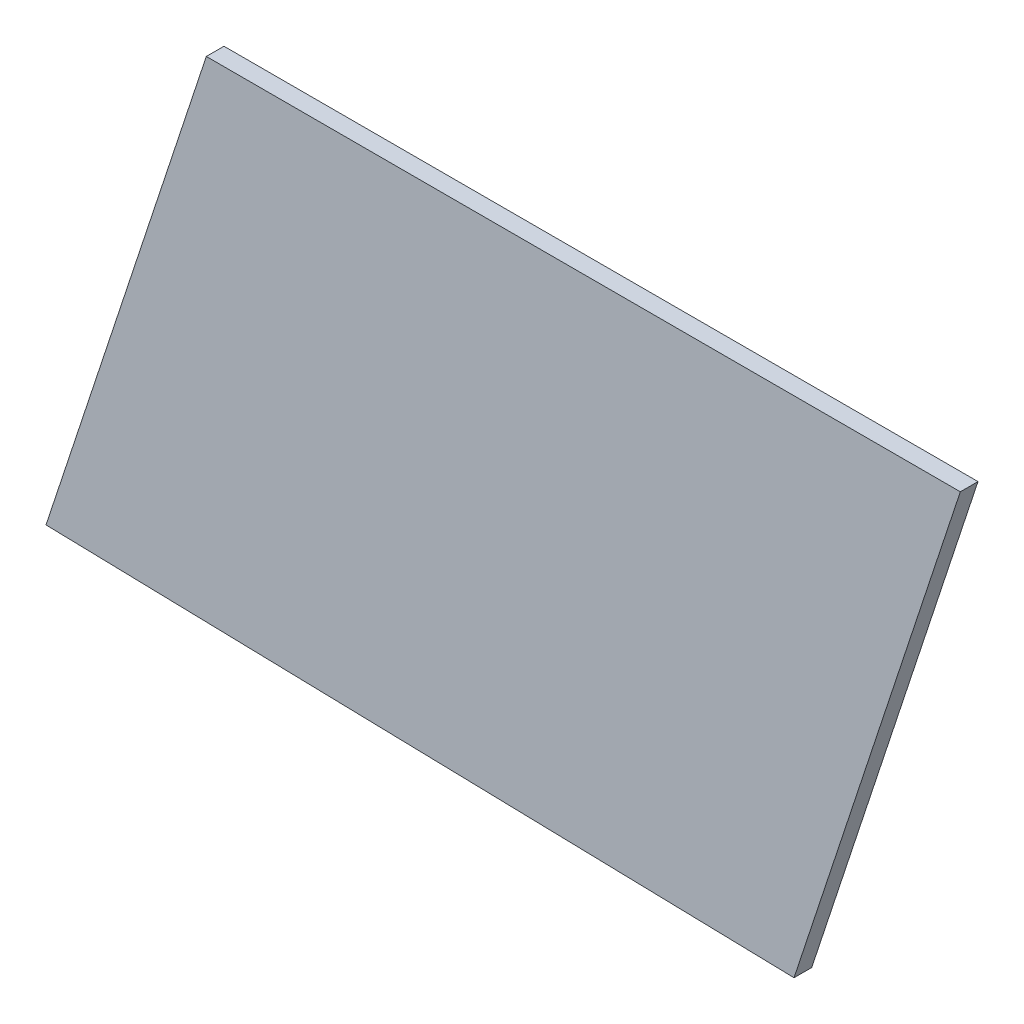
ISO-10303-21;
HEADER;
FILE_DESCRIPTION(('STEP AP214'),'2;1');
FILE_NAME('part.step','',(''),(''),'','','');
FILE_SCHEMA(('AUTOMOTIVE_DESIGN { 1 0 10303 214 1 1 1 1 }'));
ENDSEC;
DATA;
#1=APPLICATION_CONTEXT('core data for automotive mechanical design processes');
#2=APPLICATION_PROTOCOL_DEFINITION('international standard','automotive_design',2000,#1);
#3=PRODUCT_CONTEXT('',#1,'mechanical');
#4=PRODUCT('Part','Part','',(#3));
#5=PRODUCT_RELATED_PRODUCT_CATEGORY('part','',(#4));
#6=PRODUCT_DEFINITION_FORMATION('','',#4);
#7=PRODUCT_DEFINITION_CONTEXT('part definition',#1,'design');
#8=PRODUCT_DEFINITION('design','',#6,#7);
#9=PRODUCT_DEFINITION_SHAPE('','',#8);
#10=(LENGTH_UNIT() NAMED_UNIT(*) SI_UNIT(.MILLI.,.METRE.));
#11=(NAMED_UNIT(*) PLANE_ANGLE_UNIT() SI_UNIT($,.RADIAN.));
#12=(NAMED_UNIT(*) SI_UNIT($,.STERADIAN.) SOLID_ANGLE_UNIT());
#13=UNCERTAINTY_MEASURE_WITH_UNIT(LENGTH_MEASURE(1.E-05),#10,'distance_accuracy_value','');
#14=(GEOMETRIC_REPRESENTATION_CONTEXT(3) GLOBAL_UNCERTAINTY_ASSIGNED_CONTEXT((#13)) GLOBAL_UNIT_ASSIGNED_CONTEXT((#10,
#11,#12)) REPRESENTATION_CONTEXT('',''));
#15=CARTESIAN_POINT('',(0.,0.,0.));
#16=DIRECTION('',(0.,0.,1.));
#17=DIRECTION('',(1.,0.,0.));
#18=AXIS2_PLACEMENT_3D('',#15,#16,#17);
#19=CARTESIAN_POINT('',(-54.6191706498154,-24.5892302354657,2.));
#20=DIRECTION('',(0.949644454342196,-0.31332955547971,0.));
#21=DIRECTION('',(0.31332955547971,0.949644454342196,0.));
#22=AXIS2_PLACEMENT_3D('',#19,#20,#21);
#23=PLANE('',#22);
#24=DIRECTION('',(-0.31332955547971,-0.949644454342196,0.));
#25=VECTOR('',#24,1.);
#26=CARTESIAN_POINT('',(-54.6191706498154,-24.5892302354657,0.));
#27=LINE('',#26,#25);
#28=CARTESIAN_POINT('',(-54.6191706498154,-24.5892302354657,0.));
#29=VERTEX_POINT('',#28);
#30=CARTESIAN_POINT('',(-72.7647118667564,-79.585039875331,0.));
#31=VERTEX_POINT('',#30);
#32=EDGE_CURVE('E86',#29,#31,#27,.T.);
#33=ORIENTED_EDGE('',*,*,#32,.T.);
#34=DIRECTION('',(0.,0.,1.));
#35=VECTOR('',#34,1.);
#36=CARTESIAN_POINT('',(-72.7647118667564,-79.585039875331,0.));
#37=LINE('',#36,#35);
#38=CARTESIAN_POINT('',(-72.7647118667564,-79.585039875331,2.));
#39=VERTEX_POINT('',#38);
#40=EDGE_CURVE('E87',#31,#39,#37,.T.);
#41=ORIENTED_EDGE('',*,*,#40,.T.);
#42=DIRECTION('',(-0.31332955547971,-0.949644454342196,0.));
#43=VECTOR('',#42,1.);
#44=CARTESIAN_POINT('',(-54.6191706498154,-24.5892302354657,2.));
#45=LINE('',#44,#43);
#46=CARTESIAN_POINT('',(-54.6191706498154,-24.5892302354657,2.));
#47=VERTEX_POINT('',#46);
#48=EDGE_CURVE('E78',#47,#39,#45,.T.);
#49=ORIENTED_EDGE('',*,*,#48,.F.);
#50=DIRECTION('',(0.,0.,-1.));
#51=VECTOR('',#50,1.);
#52=CARTESIAN_POINT('',(-54.6191706498154,-24.5892302354657,2.));
#53=LINE('',#52,#51);
#54=EDGE_CURVE('E40',#47,#29,#53,.T.);
#55=ORIENTED_EDGE('',*,*,#54,.T.);
#56=EDGE_LOOP('',(#33,#41,#49,#55));
#57=FACE_BOUND('',#56,.T.);
#58=ADVANCED_FACE('F32',(#57),#23,.F.);
#59=CARTESIAN_POINT('',(30.7248293501846,-24.5892302354657,2.));
#60=DIRECTION('',(-0.949644454342196,0.31332955547971,0.));
#61=DIRECTION('',(-0.31332955547971,-0.949644454342196,0.));
#62=AXIS2_PLACEMENT_3D('',#59,#60,#61);
#63=PLANE('',#62);
#64=DIRECTION('',(0.31332955547971,0.949644454342196,0.));
#65=VECTOR('',#64,1.);
#66=CARTESIAN_POINT('',(30.7248293501846,-24.5892302354657,0.));
#67=LINE('',#66,#65);
#68=CARTESIAN_POINT('',(11.901447549833,-81.6394504462662,0.));
#69=VERTEX_POINT('',#68);
#70=CARTESIAN_POINT('',(30.7248293501846,-24.5892302354657,0.));
#71=VERTEX_POINT('',#70);
#72=EDGE_CURVE('E59',#69,#71,#67,.T.);
#73=ORIENTED_EDGE('',*,*,#72,.T.);
#74=DIRECTION('',(0.,0.,-1.));
#75=VECTOR('',#74,1.);
#76=CARTESIAN_POINT('',(30.7248293501846,-24.5892302354657,2.));
#77=LINE('',#76,#75);
#78=CARTESIAN_POINT('',(30.7248293501846,-24.5892302354657,2.));
#79=VERTEX_POINT('',#78);
#80=EDGE_CURVE('E11',#79,#71,#77,.T.);
#81=ORIENTED_EDGE('',*,*,#80,.F.);
#82=DIRECTION('',(0.31332955547971,0.949644454342196,0.));
#83=VECTOR('',#82,1.);
#84=CARTESIAN_POINT('',(30.7248293501846,-24.5892302354657,2.));
#85=LINE('',#84,#83);
#86=CARTESIAN_POINT('',(11.901447549833,-81.6394504462662,2.));
#87=VERTEX_POINT('',#86);
#88=EDGE_CURVE('E72',#87,#79,#85,.T.);
#89=ORIENTED_EDGE('',*,*,#88,.F.);
#90=DIRECTION('',(0.,0.,1.));
#91=VECTOR('',#90,1.);
#92=CARTESIAN_POINT('',(11.901447549833,-81.6394504462662,0.));
#93=LINE('',#92,#91);
#94=EDGE_CURVE('E75',#69,#87,#93,.T.);
#95=ORIENTED_EDGE('',*,*,#94,.F.);
#96=EDGE_LOOP('',(#73,#81,#89,#95));
#97=FACE_BOUND('',#96,.T.);
#98=ADVANCED_FACE('F74',(#97),#63,.F.);
#99=CARTESIAN_POINT('',(-54.6191706498154,-24.5892302354657,2.));
#100=DIRECTION('',(0.,-1.,0.));
#101=DIRECTION('',(1.,0.,0.));
#102=AXIS2_PLACEMENT_3D('',#99,#100,#101);
#103=PLANE('',#102);
#104=DIRECTION('',(-1.,0.,0.));
#105=VECTOR('',#104,1.);
#106=CARTESIAN_POINT('',(-54.6191706498154,-24.5892302354657,0.));
#107=LINE('',#106,#105);
#108=EDGE_CURVE('E96',#71,#29,#107,.T.);
#109=ORIENTED_EDGE('',*,*,#108,.T.);
#110=ORIENTED_EDGE('',*,*,#54,.F.);
#111=DIRECTION('',(-1.,0.,0.));
#112=VECTOR('',#111,1.);
#113=CARTESIAN_POINT('',(-54.6191706498154,-24.5892302354657,2.));
#114=LINE('',#113,#112);
#115=EDGE_CURVE('E48',#79,#47,#114,.T.);
#116=ORIENTED_EDGE('',*,*,#115,.F.);
#117=ORIENTED_EDGE('',*,*,#80,.T.);
#118=EDGE_LOOP('',(#109,#110,#116,#117));
#119=FACE_BOUND('',#118,.T.);
#120=ADVANCED_FACE('F106',(#119),#103,.F.);
#121=CARTESIAN_POINT('',(0.,0.,2.));
#122=DIRECTION('',(0.,0.,1.));
#123=DIRECTION('',(1.,0.,0.));
#124=AXIS2_PLACEMENT_3D('',#121,#122,#123);
#125=PLANE('',#124);
#126=ORIENTED_EDGE('',*,*,#48,.T.);
#127=DIRECTION('',(0.999705738774359,-0.0242576969560779,0.));
#128=VECTOR('',#127,1.);
#129=CARTESIAN_POINT('',(-72.7647118667564,-79.585039875331,2.));
#130=LINE('',#129,#128);
#131=EDGE_CURVE('E84',#39,#87,#130,.T.);
#132=ORIENTED_EDGE('',*,*,#131,.T.);
#133=ORIENTED_EDGE('',*,*,#88,.T.);
#134=ORIENTED_EDGE('',*,*,#115,.T.);
#135=EDGE_LOOP('',(#126,#132,#133,#134));
#136=FACE_BOUND('',#135,.T.);
#137=ADVANCED_FACE('F89',(#136),#125,.T.);
#138=CARTESIAN_POINT('',(0.,0.,0.));
#139=DIRECTION('',(0.,0.,1.));
#140=DIRECTION('',(1.,0.,0.));
#141=AXIS2_PLACEMENT_3D('',#138,#139,#140);
#142=PLANE('',#141);
#143=ORIENTED_EDGE('',*,*,#32,.F.);
#144=ORIENTED_EDGE('',*,*,#108,.F.);
#145=ORIENTED_EDGE('',*,*,#72,.F.);
#146=DIRECTION('',(0.999705738774359,-0.0242576969560779,0.));
#147=VECTOR('',#146,1.);
#148=CARTESIAN_POINT('',(-72.7647118667564,-79.585039875331,0.));
#149=LINE('',#148,#147);
#150=EDGE_CURVE('E85',#31,#69,#149,.T.);
#151=ORIENTED_EDGE('',*,*,#150,.F.);
#152=EDGE_LOOP('',(#143,#144,#145,#151));
#153=FACE_BOUND('',#152,.T.);
#154=ADVANCED_FACE('F105',(#153),#142,.F.);
#155=CARTESIAN_POINT('',(-72.7647118667564,-79.585039875331,0.));
#156=DIRECTION('',(-0.0242576969560779,-0.999705738774359,0.));
#157=DIRECTION('',(0.999705738774359,-0.0242576969560779,0.));
#158=AXIS2_PLACEMENT_3D('',#155,#156,#157);
#159=PLANE('',#158);
#160=ORIENTED_EDGE('',*,*,#131,.F.);
#161=ORIENTED_EDGE('',*,*,#40,.F.);
#162=ORIENTED_EDGE('',*,*,#150,.T.);
#163=ORIENTED_EDGE('',*,*,#94,.T.);
#164=EDGE_LOOP('',(#160,#161,#162,#163));
#165=FACE_BOUND('',#164,.T.);
#166=ADVANCED_FACE('F82',(#165),#159,.T.);
#167=CLOSED_SHELL('',(#58,#98,#120,#137,#154,#166));
#168=MANIFOLD_SOLID_BREP('B2',#167);
#169=ADVANCED_BREP_SHAPE_REPRESENTATION('',(#18,#168),#14);
#170=SHAPE_DEFINITION_REPRESENTATION(#9,#169);
ENDSEC;
END-ISO-10303-21;
